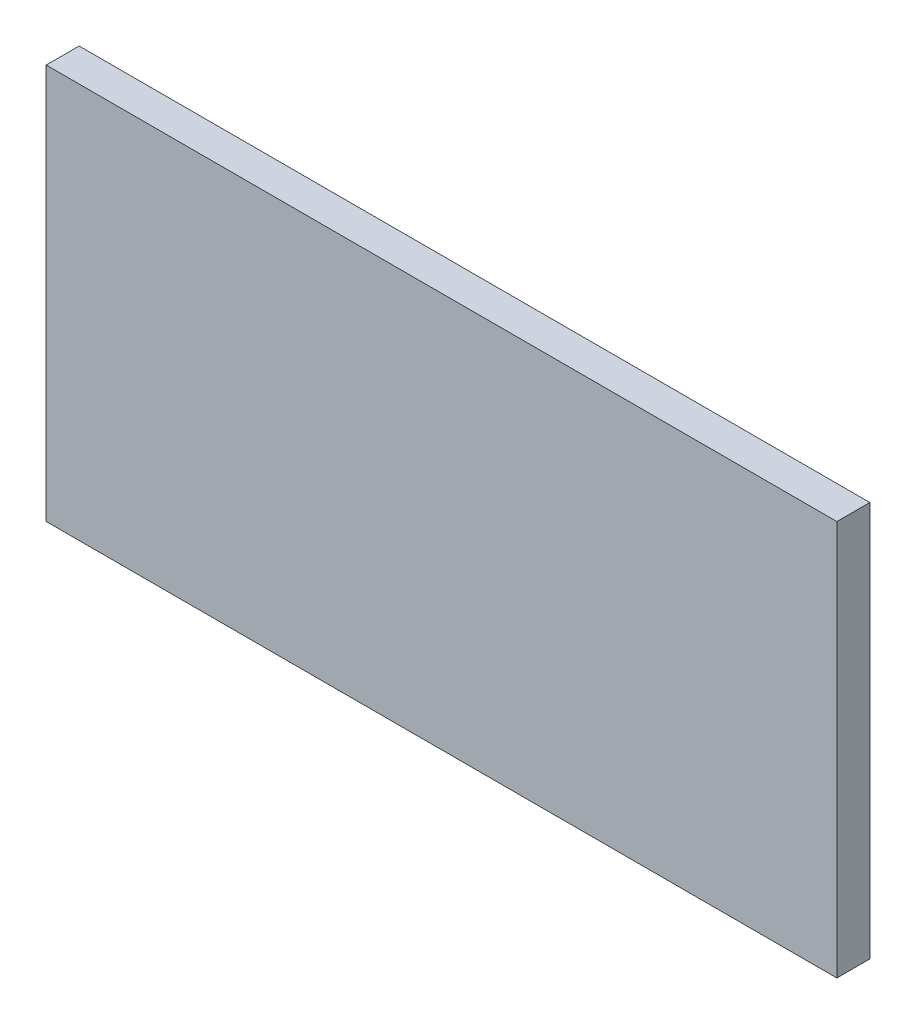
ISO-10303-21;
HEADER;
FILE_DESCRIPTION(('STEP AP214'),'2;1');
FILE_NAME('part.step','',(''),(''),'','','');
FILE_SCHEMA(('AUTOMOTIVE_DESIGN { 1 0 10303 214 1 1 1 1 }'));
ENDSEC;
DATA;
#1=APPLICATION_CONTEXT('core data for automotive mechanical design processes');
#2=APPLICATION_PROTOCOL_DEFINITION('international standard','automotive_design',2000,#1);
#3=PRODUCT_CONTEXT('',#1,'mechanical');
#4=PRODUCT('Part','Part','',(#3));
#5=PRODUCT_RELATED_PRODUCT_CATEGORY('part','',(#4));
#6=PRODUCT_DEFINITION_FORMATION('','',#4);
#7=PRODUCT_DEFINITION_CONTEXT('part definition',#1,'design');
#8=PRODUCT_DEFINITION('design','',#6,#7);
#9=PRODUCT_DEFINITION_SHAPE('','',#8);
#10=(LENGTH_UNIT() NAMED_UNIT(*) SI_UNIT(.MILLI.,.METRE.));
#11=(NAMED_UNIT(*) PLANE_ANGLE_UNIT() SI_UNIT($,.RADIAN.));
#12=(NAMED_UNIT(*) SI_UNIT($,.STERADIAN.) SOLID_ANGLE_UNIT());
#13=UNCERTAINTY_MEASURE_WITH_UNIT(LENGTH_MEASURE(1.E-05),#10,'distance_accuracy_value','');
#14=(GEOMETRIC_REPRESENTATION_CONTEXT(3) GLOBAL_UNCERTAINTY_ASSIGNED_CONTEXT((#13)) GLOBAL_UNIT_ASSIGNED_CONTEXT((#10,
#11,#12)) REPRESENTATION_CONTEXT('',''));
#15=CARTESIAN_POINT('',(0.,0.,0.));
#16=DIRECTION('',(0.,0.,1.));
#17=DIRECTION('',(1.,0.,0.));
#18=AXIS2_PLACEMENT_3D('',#15,#16,#17);
#19=CARTESIAN_POINT('',(-6.0794701986755,5.50331125827815,1.));
#20=DIRECTION('',(1.,0.,0.));
#21=DIRECTION('',(0.,0.,-1.));
#22=AXIS2_PLACEMENT_3D('',#19,#20,#21);
#23=PLANE('',#22);
#24=DIRECTION('',(0.,-1.,0.));
#25=VECTOR('',#24,1.);
#26=CARTESIAN_POINT('',(-6.0794701986755,5.50331125827815,0.));
#27=LINE('',#26,#25);
#28=CARTESIAN_POINT('',(-6.0794701986755,5.50331125827815,0.));
#29=VERTEX_POINT('',#28);
#30=CARTESIAN_POINT('',(-6.0794701986755,-6.49668874172185,0.));
#31=VERTEX_POINT('',#30);
#32=EDGE_CURVE('E96',#29,#31,#27,.T.);
#33=ORIENTED_EDGE('',*,*,#32,.T.);
#34=DIRECTION('',(0.,0.,-1.));
#35=VECTOR('',#34,1.);
#36=CARTESIAN_POINT('',(-6.0794701986755,-6.49668874172185,1.));
#37=LINE('',#36,#35);
#38=CARTESIAN_POINT('',(-6.0794701986755,-6.49668874172185,1.));
#39=VERTEX_POINT('',#38);
#40=EDGE_CURVE('E11',#39,#31,#37,.T.);
#41=ORIENTED_EDGE('',*,*,#40,.F.);
#42=DIRECTION('',(0.,-1.,0.));
#43=VECTOR('',#42,1.);
#44=CARTESIAN_POINT('',(-6.0794701986755,5.50331125827815,1.));
#45=LINE('',#44,#43);
#46=CARTESIAN_POINT('',(-6.0794701986755,5.50331125827815,1.));
#47=VERTEX_POINT('',#46);
#48=EDGE_CURVE('E84',#47,#39,#45,.T.);
#49=ORIENTED_EDGE('',*,*,#48,.F.);
#50=DIRECTION('',(0.,0.,-1.));
#51=VECTOR('',#50,1.);
#52=CARTESIAN_POINT('',(-6.0794701986755,5.50331125827815,1.));
#53=LINE('',#52,#51);
#54=EDGE_CURVE('E92',#47,#29,#53,.T.);
#55=ORIENTED_EDGE('',*,*,#54,.T.);
#56=EDGE_LOOP('',(#33,#41,#49,#55));
#57=FACE_BOUND('',#56,.T.);
#58=ADVANCED_FACE('F33',(#57),#23,.F.);
#59=CARTESIAN_POINT('',(-6.0794701986755,-6.49668874172185,1.));
#60=DIRECTION('',(0.,1.,0.));
#61=DIRECTION('',(-1.,0.,0.));
#62=AXIS2_PLACEMENT_3D('',#59,#60,#61);
#63=PLANE('',#62);
#64=DIRECTION('',(1.,0.,0.));
#65=VECTOR('',#64,1.);
#66=CARTESIAN_POINT('',(-6.0794701986755,-6.49668874172185,0.));
#67=LINE('',#66,#65);
#68=CARTESIAN_POINT('',(17.9205298013245,-6.49668874172185,0.));
#69=VERTEX_POINT('',#68);
#70=EDGE_CURVE('E88',#31,#69,#67,.T.);
#71=ORIENTED_EDGE('',*,*,#70,.T.);
#72=DIRECTION('',(0.,0.,-1.));
#73=VECTOR('',#72,1.);
#74=CARTESIAN_POINT('',(17.9205298013245,-6.49668874172185,1.));
#75=LINE('',#74,#73);
#76=CARTESIAN_POINT('',(17.9205298013245,-6.49668874172185,1.));
#77=VERTEX_POINT('',#76);
#78=EDGE_CURVE('E41',#77,#69,#75,.T.);
#79=ORIENTED_EDGE('',*,*,#78,.F.);
#80=DIRECTION('',(1.,0.,0.));
#81=VECTOR('',#80,1.);
#82=CARTESIAN_POINT('',(-6.0794701986755,-6.49668874172185,1.));
#83=LINE('',#82,#81);
#84=EDGE_CURVE('E79',#39,#77,#83,.T.);
#85=ORIENTED_EDGE('',*,*,#84,.F.);
#86=ORIENTED_EDGE('',*,*,#40,.T.);
#87=EDGE_LOOP('',(#71,#79,#85,#86));
#88=FACE_BOUND('',#87,.T.);
#89=ADVANCED_FACE('F87',(#88),#63,.F.);
#90=CARTESIAN_POINT('',(17.9205298013245,5.50331125827815,1.));
#91=DIRECTION('',(-1.,0.,0.));
#92=DIRECTION('',(0.,0.,1.));
#93=AXIS2_PLACEMENT_3D('',#90,#91,#92);
#94=PLANE('',#93);
#95=DIRECTION('',(0.,1.,0.));
#96=VECTOR('',#95,1.);
#97=CARTESIAN_POINT('',(17.9205298013245,5.50331125827815,0.));
#98=LINE('',#97,#96);
#99=CARTESIAN_POINT('',(17.9205298013245,5.50331125827815,0.));
#100=VERTEX_POINT('',#99);
#101=EDGE_CURVE('E66',#69,#100,#98,.T.);
#102=ORIENTED_EDGE('',*,*,#101,.T.);
#103=DIRECTION('',(0.,0.,-1.));
#104=VECTOR('',#103,1.);
#105=CARTESIAN_POINT('',(17.9205298013245,5.50331125827815,1.));
#106=LINE('',#105,#104);
#107=CARTESIAN_POINT('',(17.9205298013245,5.50331125827815,1.));
#108=VERTEX_POINT('',#107);
#109=EDGE_CURVE('E89',#108,#100,#106,.T.);
#110=ORIENTED_EDGE('',*,*,#109,.F.);
#111=DIRECTION('',(0.,1.,0.));
#112=VECTOR('',#111,1.);
#113=CARTESIAN_POINT('',(17.9205298013245,5.50331125827815,1.));
#114=LINE('',#113,#112);
#115=EDGE_CURVE('E82',#77,#108,#114,.T.);
#116=ORIENTED_EDGE('',*,*,#115,.F.);
#117=ORIENTED_EDGE('',*,*,#78,.T.);
#118=EDGE_LOOP('',(#102,#110,#116,#117));
#119=FACE_BOUND('',#118,.T.);
#120=ADVANCED_FACE('F90',(#119),#94,.F.);
#121=CARTESIAN_POINT('',(-6.0794701986755,5.50331125827815,1.));
#122=DIRECTION('',(0.,-1.,0.));
#123=DIRECTION('',(0.,0.,-1.));
#124=AXIS2_PLACEMENT_3D('',#121,#122,#123);
#125=PLANE('',#124);
#126=DIRECTION('',(-1.,0.,0.));
#127=VECTOR('',#126,1.);
#128=CARTESIAN_POINT('',(-6.0794701986755,5.50331125827815,0.));
#129=LINE('',#128,#127);
#130=EDGE_CURVE('E72',#100,#29,#129,.T.);
#131=ORIENTED_EDGE('',*,*,#130,.T.);
#132=ORIENTED_EDGE('',*,*,#54,.F.);
#133=DIRECTION('',(-1.,0.,0.));
#134=VECTOR('',#133,1.);
#135=CARTESIAN_POINT('',(-6.0794701986755,5.50331125827815,1.));
#136=LINE('',#135,#134);
#137=EDGE_CURVE('E49',#108,#47,#136,.T.);
#138=ORIENTED_EDGE('',*,*,#137,.F.);
#139=ORIENTED_EDGE('',*,*,#109,.T.);
#140=EDGE_LOOP('',(#131,#132,#138,#139));
#141=FACE_BOUND('',#140,.T.);
#142=ADVANCED_FACE('F103',(#141),#125,.F.);
#143=CARTESIAN_POINT('',(0.,0.,1.));
#144=DIRECTION('',(0.,0.,1.));
#145=DIRECTION('',(1.,0.,0.));
#146=AXIS2_PLACEMENT_3D('',#143,#144,#145);
#147=PLANE('',#146);
#148=ORIENTED_EDGE('',*,*,#48,.T.);
#149=ORIENTED_EDGE('',*,*,#84,.T.);
#150=ORIENTED_EDGE('',*,*,#115,.T.);
#151=ORIENTED_EDGE('',*,*,#137,.T.);
#152=EDGE_LOOP('',(#148,#149,#150,#151));
#153=FACE_BOUND('',#152,.T.);
#154=ADVANCED_FACE('F80',(#153),#147,.T.);
#155=CARTESIAN_POINT('',(0.,0.,0.));
#156=DIRECTION('',(0.,0.,1.));
#157=DIRECTION('',(1.,0.,0.));
#158=AXIS2_PLACEMENT_3D('',#155,#156,#157);
#159=PLANE('',#158);
#160=ORIENTED_EDGE('',*,*,#32,.F.);
#161=ORIENTED_EDGE('',*,*,#130,.F.);
#162=ORIENTED_EDGE('',*,*,#101,.F.);
#163=ORIENTED_EDGE('',*,*,#70,.F.);
#164=EDGE_LOOP('',(#160,#161,#162,#163));
#165=FACE_BOUND('',#164,.T.);
#166=ADVANCED_FACE('F106',(#165),#159,.F.);
#167=CLOSED_SHELL('',(#58,#89,#120,#142,#154,#166));
#168=MANIFOLD_SOLID_BREP('B2',#167);
#169=ADVANCED_BREP_SHAPE_REPRESENTATION('',(#18,#168),#14);
#170=SHAPE_DEFINITION_REPRESENTATION(#9,#169);
ENDSEC;
END-ISO-10303-21;
